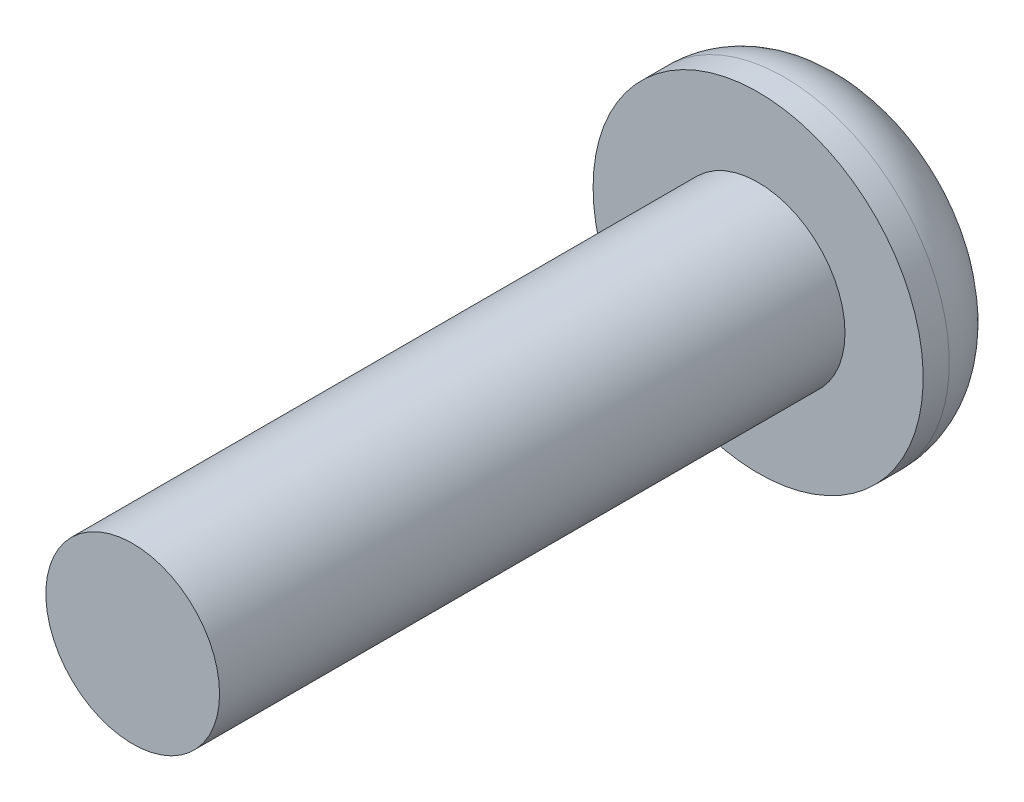
ISO-10303-21;
HEADER;
FILE_DESCRIPTION(('STEP AP214'),'2;1');
FILE_NAME('part.step','',(''),(''),'','','');
FILE_SCHEMA(('AUTOMOTIVE_DESIGN { 1 0 10303 214 1 1 1 1 }'));
ENDSEC;
DATA;
#1=APPLICATION_CONTEXT('core data for automotive mechanical design processes');
#2=APPLICATION_PROTOCOL_DEFINITION('international standard','automotive_design',2000,#1);
#3=PRODUCT_CONTEXT('',#1,'mechanical');
#4=PRODUCT('Part','Part','',(#3));
#5=PRODUCT_RELATED_PRODUCT_CATEGORY('part','',(#4));
#6=PRODUCT_DEFINITION_FORMATION('','',#4);
#7=PRODUCT_DEFINITION_CONTEXT('part definition',#1,'design');
#8=PRODUCT_DEFINITION('design','',#6,#7);
#9=PRODUCT_DEFINITION_SHAPE('','',#8);
#10=(LENGTH_UNIT() NAMED_UNIT(*) SI_UNIT(.MILLI.,.METRE.));
#11=(NAMED_UNIT(*) PLANE_ANGLE_UNIT() SI_UNIT($,.RADIAN.));
#12=(NAMED_UNIT(*) SI_UNIT($,.STERADIAN.) SOLID_ANGLE_UNIT());
#13=UNCERTAINTY_MEASURE_WITH_UNIT(LENGTH_MEASURE(1.E-05),#10,'distance_accuracy_value','');
#14=(GEOMETRIC_REPRESENTATION_CONTEXT(3) GLOBAL_UNCERTAINTY_ASSIGNED_CONTEXT((#13)) GLOBAL_UNIT_ASSIGNED_CONTEXT((#10,
#11,#12)) REPRESENTATION_CONTEXT('',''));
#15=CARTESIAN_POINT('',(0.,0.,0.));
#16=DIRECTION('',(0.,0.,1.));
#17=DIRECTION('',(1.,0.,0.));
#18=AXIS2_PLACEMENT_3D('',#15,#16,#17);
#19=CARTESIAN_POINT('',(0.,0.,18.));
#20=DIRECTION('',(0.,0.,-1.));
#21=DIRECTION('',(-1.,0.,0.));
#22=AXIS2_PLACEMENT_3D('',#19,#20,#21);
#23=CYLINDRICAL_SURFACE('',#22,2.5);
#24=CARTESIAN_POINT('',(0.,0.,18.));
#25=DIRECTION('',(0.,0.,1.));
#26=DIRECTION('',(1.,0.,0.));
#27=AXIS2_PLACEMENT_3D('',#24,#25,#26);
#28=CIRCLE('',#27,2.5);
#29=CARTESIAN_POINT('',(2.5,0.,18.));
#30=VERTEX_POINT('',#29);
#31=EDGE_CURVE('E45',#30,#30,#28,.T.);
#32=ORIENTED_EDGE('',*,*,#31,.F.);
#33=EDGE_LOOP('',(#32));
#34=FACE_BOUND('',#33,.T.);
#35=CARTESIAN_POINT('',(0.,0.,0.));
#36=DIRECTION('',(0.,0.,1.));
#37=DIRECTION('',(1.,0.,0.));
#38=AXIS2_PLACEMENT_3D('',#35,#36,#37);
#39=CIRCLE('',#38,2.5);
#40=CARTESIAN_POINT('',(2.5,0.,0.));
#41=VERTEX_POINT('',#40);
#42=EDGE_CURVE('E49',#41,#41,#39,.T.);
#43=ORIENTED_EDGE('',*,*,#42,.T.);
#44=EDGE_LOOP('',(#43));
#45=FACE_BOUND('',#44,.T.);
#46=ADVANCED_FACE('F34',(#34,#45),#23,.T.);
#47=CARTESIAN_POINT('',(0.,0.,18.));
#48=DIRECTION('',(0.,0.,1.));
#49=DIRECTION('',(1.,0.,0.));
#50=AXIS2_PLACEMENT_3D('',#47,#48,#49);
#51=PLANE('',#50);
#52=ORIENTED_EDGE('',*,*,#31,.T.);
#53=EDGE_LOOP('',(#52));
#54=FACE_BOUND('',#53,.T.);
#55=ADVANCED_FACE('F74',(#54),#51,.T.);
#56=CARTESIAN_POINT('',(0.,0.,-2.75));
#57=DIRECTION('',(0.,0.,1.));
#58=DIRECTION('',(1.,0.,0.));
#59=AXIS2_PLACEMENT_3D('',#56,#57,#58);
#60=CYLINDRICAL_SURFACE('',#59,4.75);
#61=CARTESIAN_POINT('',(0.,0.,-0.75));
#62=DIRECTION('',(0.,0.,-1.));
#63=DIRECTION('',(-1.,0.,0.));
#64=AXIS2_PLACEMENT_3D('',#61,#62,#63);
#65=CIRCLE('',#64,4.75);
#66=CARTESIAN_POINT('',(-4.75,0.,-0.75));
#67=VERTEX_POINT('',#66);
#68=EDGE_CURVE('E10',#67,#67,#65,.F.);
#69=ORIENTED_EDGE('',*,*,#68,.T.);
#70=EDGE_LOOP('',(#69));
#71=FACE_BOUND('',#70,.T.);
#72=CARTESIAN_POINT('',(0.,0.,0.));
#73=DIRECTION('',(0.,0.,-1.));
#74=DIRECTION('',(-1.,0.,0.));
#75=AXIS2_PLACEMENT_3D('',#72,#73,#74);
#76=CIRCLE('',#75,4.75);
#77=CARTESIAN_POINT('',(-4.75,0.,0.));
#78=VERTEX_POINT('',#77);
#79=EDGE_CURVE('E53',#78,#78,#76,.T.);
#80=ORIENTED_EDGE('',*,*,#79,.T.);
#81=EDGE_LOOP('',(#80));
#82=FACE_BOUND('',#81,.T.);
#83=ADVANCED_FACE('F58',(#71,#82),#60,.T.);
#84=CARTESIAN_POINT('',(0.,0.,-2.75));
#85=DIRECTION('',(0.,0.,-1.));
#86=DIRECTION('',(-1.,0.,0.));
#87=AXIS2_PLACEMENT_3D('',#84,#85,#86);
#88=PLANE('',#87);
#89=CARTESIAN_POINT('',(0.,0.,-2.75));
#90=DIRECTION('',(0.,0.,-1.));
#91=DIRECTION('',(-1.,0.,0.));
#92=AXIS2_PLACEMENT_3D('',#89,#90,#91);
#93=CIRCLE('',#92,2.75);
#94=CARTESIAN_POINT('',(-2.75,0.,-2.75));
#95=VERTEX_POINT('',#94);
#96=EDGE_CURVE('E41',#95,#95,#93,.T.);
#97=ORIENTED_EDGE('',*,*,#96,.T.);
#98=EDGE_LOOP('',(#97));
#99=FACE_BOUND('',#98,.T.);
#100=ADVANCED_FACE('F62',(#99),#88,.T.);
#101=CARTESIAN_POINT('',(0.,0.,0.));
#102=DIRECTION('',(0.,0.,-1.));
#103=DIRECTION('',(-1.,0.,0.));
#104=AXIS2_PLACEMENT_3D('',#101,#102,#103);
#105=PLANE('',#104);
#106=ORIENTED_EDGE('',*,*,#42,.F.);
#107=EDGE_LOOP('',(#106));
#108=FACE_BOUND('',#107,.T.);
#109=ORIENTED_EDGE('',*,*,#79,.F.);
#110=EDGE_LOOP('',(#109));
#111=FACE_BOUND('',#110,.T.);
#112=ADVANCED_FACE('F60',(#108,#111),#105,.F.);
#113=CARTESIAN_POINT('',(0.,0.,-0.75));
#114=DIRECTION('',(0.,0.,-1.));
#115=DIRECTION('',(-1.,0.,0.));
#116=AXIS2_PLACEMENT_3D('',#113,#114,#115);
#117=TOROIDAL_SURFACE('',#116,2.75,2.);
#118=ORIENTED_EDGE('',*,*,#68,.F.);
#119=EDGE_LOOP('',(#118));
#120=FACE_BOUND('',#119,.T.);
#121=ORIENTED_EDGE('',*,*,#96,.F.);
#122=EDGE_LOOP('',(#121));
#123=FACE_BOUND('',#122,.T.);
#124=ADVANCED_FACE('F36',(#120,#123),#117,.T.);
#125=CLOSED_SHELL('',(#46,#55,#83,#100,#112,#124));
#126=MANIFOLD_SOLID_BREP('B2',#125);
#127=ADVANCED_BREP_SHAPE_REPRESENTATION('',(#18,#126),#14);
#128=SHAPE_DEFINITION_REPRESENTATION(#9,#127);
ENDSEC;
END-ISO-10303-21;
